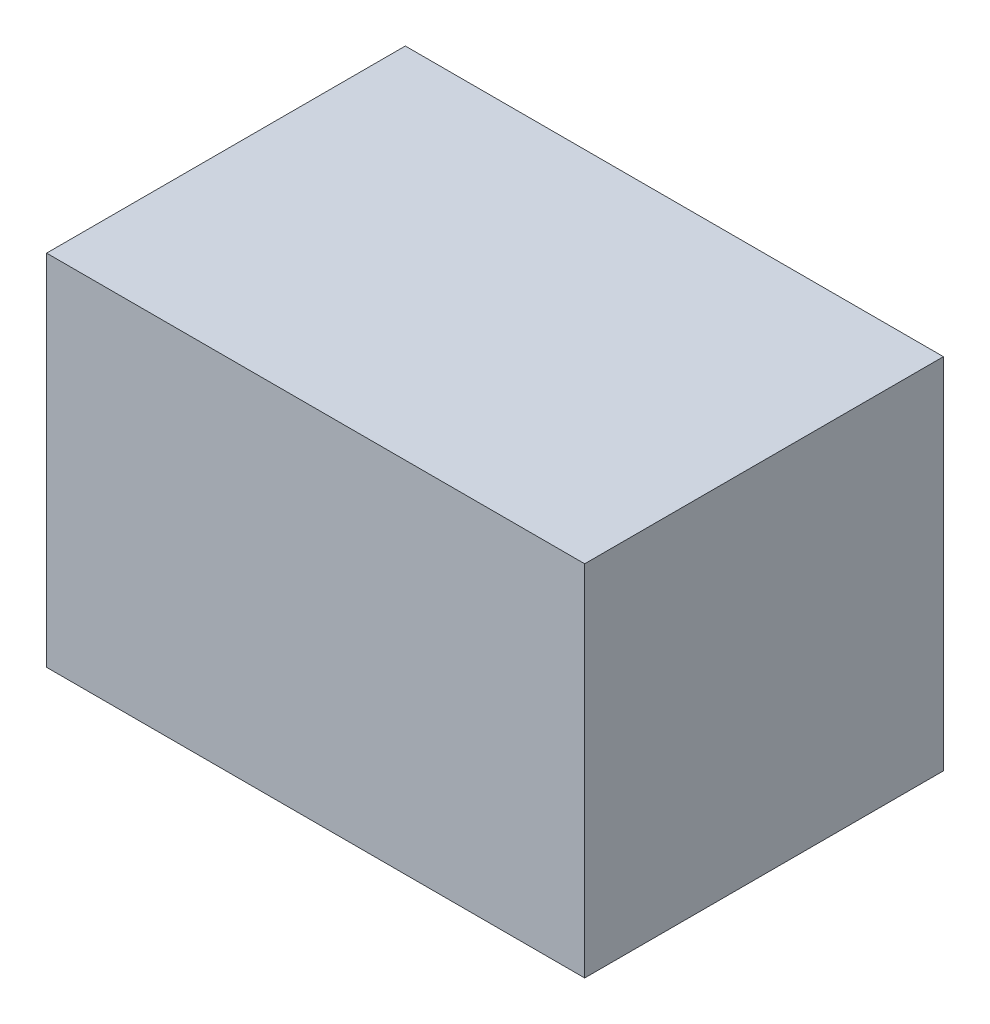
ISO-10303-21;
HEADER;
FILE_DESCRIPTION(('STEP AP214'),'2;1');
FILE_NAME('part.step','',(''),(''),'','','');
FILE_SCHEMA(('AUTOMOTIVE_DESIGN { 1 0 10303 214 1 1 1 1 }'));
ENDSEC;
DATA;
#1=APPLICATION_CONTEXT('core data for automotive mechanical design processes');
#2=APPLICATION_PROTOCOL_DEFINITION('international standard','automotive_design',2000,#1);
#3=PRODUCT_CONTEXT('',#1,'mechanical');
#4=PRODUCT('Part','Part','',(#3));
#5=PRODUCT_RELATED_PRODUCT_CATEGORY('part','',(#4));
#6=PRODUCT_DEFINITION_FORMATION('','',#4);
#7=PRODUCT_DEFINITION_CONTEXT('part definition',#1,'design');
#8=PRODUCT_DEFINITION('design','',#6,#7);
#9=PRODUCT_DEFINITION_SHAPE('','',#8);
#10=(LENGTH_UNIT() NAMED_UNIT(*) SI_UNIT(.MILLI.,.METRE.));
#11=(NAMED_UNIT(*) PLANE_ANGLE_UNIT() SI_UNIT($,.RADIAN.));
#12=(NAMED_UNIT(*) SI_UNIT($,.STERADIAN.) SOLID_ANGLE_UNIT());
#13=UNCERTAINTY_MEASURE_WITH_UNIT(LENGTH_MEASURE(1.E-05),#10,'distance_accuracy_value','');
#14=(GEOMETRIC_REPRESENTATION_CONTEXT(3) GLOBAL_UNCERTAINTY_ASSIGNED_CONTEXT((#13)) GLOBAL_UNIT_ASSIGNED_CONTEXT((#10,
#11,#12)) REPRESENTATION_CONTEXT('',''));
#15=CARTESIAN_POINT('',(0.,0.,0.));
#16=DIRECTION('',(0.,0.,1.));
#17=DIRECTION('',(1.,0.,0.));
#18=AXIS2_PLACEMENT_3D('',#15,#16,#17);
#19=CARTESIAN_POINT('',(30.,-20.,40.));
#20=DIRECTION('',(-1.,0.,0.));
#21=DIRECTION('',(0.,0.,1.));
#22=AXIS2_PLACEMENT_3D('',#19,#20,#21);
#23=PLANE('',#22);
#24=DIRECTION('',(0.,1.,0.));
#25=VECTOR('',#24,1.);
#26=CARTESIAN_POINT('',(30.,-20.,0.));
#27=LINE('',#26,#25);
#28=CARTESIAN_POINT('',(30.,-20.,0.));
#29=VERTEX_POINT('',#28);
#30=CARTESIAN_POINT('',(30.,20.,0.));
#31=VERTEX_POINT('',#30);
#32=EDGE_CURVE('E113',#29,#31,#27,.T.);
#33=ORIENTED_EDGE('',*,*,#32,.T.);
#34=DIRECTION('',(0.,0.,-1.));
#35=VECTOR('',#34,1.);
#36=CARTESIAN_POINT('',(30.,20.,40.));
#37=LINE('',#36,#35);
#38=CARTESIAN_POINT('',(30.,20.,40.));
#39=VERTEX_POINT('',#38);
#40=EDGE_CURVE('E11',#39,#31,#37,.T.);
#41=ORIENTED_EDGE('',*,*,#40,.F.);
#42=DIRECTION('',(0.,1.,0.));
#43=VECTOR('',#42,1.);
#44=CARTESIAN_POINT('',(30.,-20.,40.));
#45=LINE('',#44,#43);
#46=CARTESIAN_POINT('',(30.,-20.,40.));
#47=VERTEX_POINT('',#46);
#48=EDGE_CURVE('E97',#47,#39,#45,.T.);
#49=ORIENTED_EDGE('',*,*,#48,.F.);
#50=DIRECTION('',(0.,0.,-1.));
#51=VECTOR('',#50,1.);
#52=CARTESIAN_POINT('',(30.,-20.,40.));
#53=LINE('',#52,#51);
#54=EDGE_CURVE('E109',#47,#29,#53,.T.);
#55=ORIENTED_EDGE('',*,*,#54,.T.);
#56=EDGE_LOOP('',(#33,#41,#49,#55));
#57=FACE_BOUND('',#56,.T.);
#58=ADVANCED_FACE('F45',(#57),#23,.F.);
#59=CARTESIAN_POINT('',(-30.,20.,40.));
#60=DIRECTION('',(0.,-1.,0.));
#61=DIRECTION('',(0.,0.,-1.));
#62=AXIS2_PLACEMENT_3D('',#59,#60,#61);
#63=PLANE('',#62);
#64=DIRECTION('',(-1.,0.,0.));
#65=VECTOR('',#64,1.);
#66=CARTESIAN_POINT('',(-30.,20.,0.));
#67=LINE('',#66,#65);
#68=CARTESIAN_POINT('',(-30.,20.,0.));
#69=VERTEX_POINT('',#68);
#70=EDGE_CURVE('E102',#31,#69,#67,.T.);
#71=ORIENTED_EDGE('',*,*,#70,.T.);
#72=DIRECTION('',(0.,0.,-1.));
#73=VECTOR('',#72,1.);
#74=CARTESIAN_POINT('',(-30.,20.,40.));
#75=LINE('',#74,#73);
#76=CARTESIAN_POINT('',(-30.,20.,40.));
#77=VERTEX_POINT('',#76);
#78=EDGE_CURVE('E54',#77,#69,#75,.T.);
#79=ORIENTED_EDGE('',*,*,#78,.F.);
#80=DIRECTION('',(-1.,0.,0.));
#81=VECTOR('',#80,1.);
#82=CARTESIAN_POINT('',(-30.,20.,40.));
#83=LINE('',#82,#81);
#84=EDGE_CURVE('E92',#39,#77,#83,.T.);
#85=ORIENTED_EDGE('',*,*,#84,.F.);
#86=ORIENTED_EDGE('',*,*,#40,.T.);
#87=EDGE_LOOP('',(#71,#79,#85,#86));
#88=FACE_BOUND('',#87,.T.);
#89=ADVANCED_FACE('F101',(#88),#63,.F.);
#90=CARTESIAN_POINT('',(-30.,-20.,40.));
#91=DIRECTION('',(1.,0.,0.));
#92=DIRECTION('',(0.,0.,-1.));
#93=AXIS2_PLACEMENT_3D('',#90,#91,#92);
#94=PLANE('',#93);
#95=DIRECTION('',(0.,-1.,0.));
#96=VECTOR('',#95,1.);
#97=CARTESIAN_POINT('',(-30.,-20.,0.));
#98=LINE('',#97,#96);
#99=CARTESIAN_POINT('',(-30.,-20.,0.));
#100=VERTEX_POINT('',#99);
#101=EDGE_CURVE('E79',#69,#100,#98,.T.);
#102=ORIENTED_EDGE('',*,*,#101,.T.);
#103=DIRECTION('',(0.,0.,-1.));
#104=VECTOR('',#103,1.);
#105=CARTESIAN_POINT('',(-30.,-20.,40.));
#106=LINE('',#105,#104);
#107=CARTESIAN_POINT('',(-30.,-20.,40.));
#108=VERTEX_POINT('',#107);
#109=EDGE_CURVE('E104',#108,#100,#106,.T.);
#110=ORIENTED_EDGE('',*,*,#109,.F.);
#111=DIRECTION('',(0.,-1.,0.));
#112=VECTOR('',#111,1.);
#113=CARTESIAN_POINT('',(-30.,-20.,40.));
#114=LINE('',#113,#112);
#115=EDGE_CURVE('E95',#77,#108,#114,.T.);
#116=ORIENTED_EDGE('',*,*,#115,.F.);
#117=ORIENTED_EDGE('',*,*,#78,.T.);
#118=EDGE_LOOP('',(#102,#110,#116,#117));
#119=FACE_BOUND('',#118,.T.);
#120=ADVANCED_FACE('F105',(#119),#94,.F.);
#121=CARTESIAN_POINT('',(-30.,-20.,40.));
#122=DIRECTION('',(0.,1.,0.));
#123=DIRECTION('',(0.,0.,1.));
#124=AXIS2_PLACEMENT_3D('',#121,#122,#123);
#125=PLANE('',#124);
#126=DIRECTION('',(1.,0.,0.));
#127=VECTOR('',#126,1.);
#128=CARTESIAN_POINT('',(-30.,-20.,0.));
#129=LINE('',#128,#127);
#130=EDGE_CURVE('E85',#100,#29,#129,.T.);
#131=ORIENTED_EDGE('',*,*,#130,.T.);
#132=ORIENTED_EDGE('',*,*,#54,.F.);
#133=DIRECTION('',(1.,0.,0.));
#134=VECTOR('',#133,1.);
#135=CARTESIAN_POINT('',(-30.,-20.,40.));
#136=LINE('',#135,#134);
#137=EDGE_CURVE('E62',#108,#47,#136,.T.);
#138=ORIENTED_EDGE('',*,*,#137,.F.);
#139=ORIENTED_EDGE('',*,*,#109,.T.);
#140=EDGE_LOOP('',(#131,#132,#138,#139));
#141=FACE_BOUND('',#140,.T.);
#142=ADVANCED_FACE('F126',(#141),#125,.F.);
#143=CARTESIAN_POINT('',(0.,0.,40.));
#144=DIRECTION('',(0.,0.,-1.));
#145=DIRECTION('',(-1.,0.,0.));
#146=AXIS2_PLACEMENT_3D('',#143,#144,#145);
#147=PLANE('',#146);
#148=ORIENTED_EDGE('',*,*,#48,.T.);
#149=ORIENTED_EDGE('',*,*,#84,.T.);
#150=ORIENTED_EDGE('',*,*,#115,.T.);
#151=ORIENTED_EDGE('',*,*,#137,.T.);
#152=EDGE_LOOP('',(#148,#149,#150,#151));
#153=FACE_BOUND('',#152,.T.);
#154=ADVANCED_FACE('F93',(#153),#147,.F.);
#155=CARTESIAN_POINT('',(0.,0.,0.));
#156=DIRECTION('',(0.,0.,-1.));
#157=DIRECTION('',(-1.,0.,0.));
#158=AXIS2_PLACEMENT_3D('',#155,#156,#157);
#159=PLANE('',#158);
#160=ORIENTED_EDGE('',*,*,#32,.F.);
#161=ORIENTED_EDGE('',*,*,#130,.F.);
#162=ORIENTED_EDGE('',*,*,#101,.F.);
#163=ORIENTED_EDGE('',*,*,#70,.F.);
#164=EDGE_LOOP('',(#160,#161,#162,#163));
#165=FACE_BOUND('',#164,.T.);
#166=ADVANCED_FACE('F129',(#165),#159,.T.);
#167=CLOSED_SHELL('',(#58,#89,#120,#142,#154,#166));
#168=MANIFOLD_SOLID_BREP('B2',#167);
#169=ADVANCED_BREP_SHAPE_REPRESENTATION('',(#18,#168),#14);
#170=SHAPE_DEFINITION_REPRESENTATION(#9,#169);
ENDSEC;
END-ISO-10303-21;
